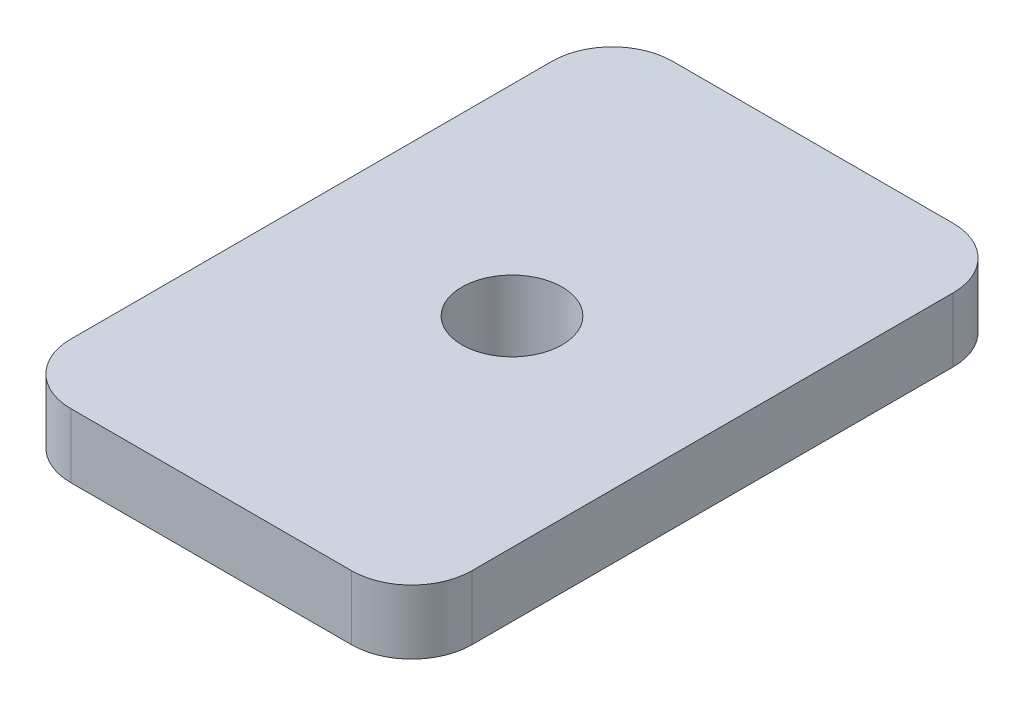
ISO-10303-21;
HEADER;
FILE_DESCRIPTION(('STEP AP214'),'2;1');
FILE_NAME('part.step','',(''),(''),'','','');
FILE_SCHEMA(('AUTOMOTIVE_DESIGN { 1 0 10303 214 1 1 1 1 }'));
ENDSEC;
DATA;
#1=APPLICATION_CONTEXT('core data for automotive mechanical design processes');
#2=APPLICATION_PROTOCOL_DEFINITION('international standard','automotive_design',2000,#1);
#3=PRODUCT_CONTEXT('',#1,'mechanical');
#4=PRODUCT('Part','Part','',(#3));
#5=PRODUCT_RELATED_PRODUCT_CATEGORY('part','',(#4));
#6=PRODUCT_DEFINITION_FORMATION('','',#4);
#7=PRODUCT_DEFINITION_CONTEXT('part definition',#1,'design');
#8=PRODUCT_DEFINITION('design','',#6,#7);
#9=PRODUCT_DEFINITION_SHAPE('','',#8);
#10=(LENGTH_UNIT() NAMED_UNIT(*) SI_UNIT(.MILLI.,.METRE.));
#11=(NAMED_UNIT(*) PLANE_ANGLE_UNIT() SI_UNIT($,.RADIAN.));
#12=(NAMED_UNIT(*) SI_UNIT($,.STERADIAN.) SOLID_ANGLE_UNIT());
#13=UNCERTAINTY_MEASURE_WITH_UNIT(LENGTH_MEASURE(1.E-05),#10,'distance_accuracy_value','');
#14=(GEOMETRIC_REPRESENTATION_CONTEXT(3) GLOBAL_UNCERTAINTY_ASSIGNED_CONTEXT((#13)) GLOBAL_UNIT_ASSIGNED_CONTEXT((#10,
#11,#12)) REPRESENTATION_CONTEXT('',''));
#15=CARTESIAN_POINT('',(0.,0.,0.));
#16=DIRECTION('',(0.,0.,1.));
#17=DIRECTION('',(1.,0.,0.));
#18=AXIS2_PLACEMENT_3D('',#15,#16,#17);
#19=CARTESIAN_POINT('',(0.,1.59999999999999,0.));
#20=DIRECTION('',(1.00000000000001,0.,0.));
#21=DIRECTION('',(0.,0.,-1.));
#22=AXIS2_PLACEMENT_3D('',#19,#20,#21);
#23=PLANE('',#22);
#24=DIRECTION('',(0.,0.,1.));
#25=VECTOR('',#24,1.);
#26=CARTESIAN_POINT('',(0.,1.59999999999999,0.));
#27=LINE('',#26,#25);
#28=CARTESIAN_POINT('',(-5.55111512312578E-13,1.59999999999971,-13.5));
#29=VERTEX_POINT('',#28);
#30=CARTESIAN_POINT('',(0.,1.59999999999999,-1.49999999999995));
#31=VERTEX_POINT('',#30);
#32=EDGE_CURVE('E136',#29,#31,#27,.T.);
#33=ORIENTED_EDGE('',*,*,#32,.F.);
#34=DIRECTION('',(0.,-1.,0.));
#35=VECTOR('',#34,1.);
#36=CARTESIAN_POINT('',(-5.55111512312578E-13,1.59999999999971,-13.5));
#37=LINE('',#36,#35);
#38=CARTESIAN_POINT('',(-5.55111512312578E-13,-2.77555756156289E-13,-13.5));
#39=VERTEX_POINT('',#38);
#40=EDGE_CURVE('E121',#29,#39,#37,.T.);
#41=ORIENTED_EDGE('',*,*,#40,.T.);
#42=DIRECTION('',(0.,0.,1.));
#43=VECTOR('',#42,1.);
#44=CARTESIAN_POINT('',(0.,0.,0.));
#45=LINE('',#44,#43);
#46=CARTESIAN_POINT('',(0.,0.,-1.49999999999995));
#47=VERTEX_POINT('',#46);
#48=EDGE_CURVE('E133',#39,#47,#45,.T.);
#49=ORIENTED_EDGE('',*,*,#48,.T.);
#50=DIRECTION('',(0.,-1.,0.));
#51=VECTOR('',#50,1.);
#52=CARTESIAN_POINT('',(0.,1.59999999999999,-1.49999999999995));
#53=LINE('',#52,#51);
#54=EDGE_CURVE('E138',#47,#31,#53,.F.);
#55=ORIENTED_EDGE('',*,*,#54,.T.);
#56=EDGE_LOOP('',(#33,#41,#49,#55));
#57=FACE_BOUND('',#56,.T.);
#58=ADVANCED_FACE('F49',(#57),#23,.F.);
#59=CARTESIAN_POINT('',(0.,1.59999999999999,0.));
#60=DIRECTION('',(0.,0.,-1.));
#61=DIRECTION('',(-1.00000000000001,0.,0.));
#62=AXIS2_PLACEMENT_3D('',#59,#60,#61);
#63=PLANE('',#62);
#64=DIRECTION('',(1.00000000000001,0.,0.));
#65=VECTOR('',#64,1.);
#66=CARTESIAN_POINT('',(0.,1.59999999999999,0.));
#67=LINE('',#66,#65);
#68=CARTESIAN_POINT('',(1.49999999999995,1.59999999999999,0.));
#69=VERTEX_POINT('',#68);
#70=CARTESIAN_POINT('',(8.49999999999995,1.60000000000055,1.11022302462516E-13));
#71=VERTEX_POINT('',#70);
#72=EDGE_CURVE('E183',#69,#71,#67,.T.);
#73=ORIENTED_EDGE('',*,*,#72,.F.);
#74=DIRECTION('',(0.,-1.,0.));
#75=VECTOR('',#74,1.);
#76=CARTESIAN_POINT('',(1.49999999999995,1.59999999999999,0.));
#77=LINE('',#76,#75);
#78=CARTESIAN_POINT('',(1.49999999999995,0.,0.));
#79=VERTEX_POINT('',#78);
#80=EDGE_CURVE('E53',#69,#79,#77,.T.);
#81=ORIENTED_EDGE('',*,*,#80,.T.);
#82=DIRECTION('',(1.00000000000001,0.,0.));
#83=VECTOR('',#82,1.);
#84=CARTESIAN_POINT('',(0.,0.,0.));
#85=LINE('',#84,#83);
#86=CARTESIAN_POINT('',(8.49999999999995,5.55111512312578E-13,1.11022302462516E-13));
#87=VERTEX_POINT('',#86);
#88=EDGE_CURVE('E143',#79,#87,#85,.T.);
#89=ORIENTED_EDGE('',*,*,#88,.T.);
#90=DIRECTION('',(0.,-1.,0.));
#91=VECTOR('',#90,1.);
#92=CARTESIAN_POINT('',(8.49999999999995,1.60000000000055,1.11022302462516E-13));
#93=LINE('',#92,#91);
#94=EDGE_CURVE('E176',#87,#71,#93,.F.);
#95=ORIENTED_EDGE('',*,*,#94,.T.);
#96=EDGE_LOOP('',(#73,#81,#89,#95));
#97=FACE_BOUND('',#96,.T.);
#98=ADVANCED_FACE('F182',(#97),#63,.F.);
#99=CARTESIAN_POINT('',(10.,1.6000000000011,1.11022302462516E-13));
#100=DIRECTION('',(-1.00000000000001,0.,0.));
#101=DIRECTION('',(0.,0.,1.));
#102=AXIS2_PLACEMENT_3D('',#99,#100,#101);
#103=PLANE('',#102);
#104=DIRECTION('',(0.,0.,-1.));
#105=VECTOR('',#104,1.);
#106=CARTESIAN_POINT('',(10.,1.11022302462516E-12,0.));
#107=LINE('',#106,#105);
#108=CARTESIAN_POINT('',(10.,1.11022302462516E-12,-1.50000000000006));
#109=VERTEX_POINT('',#108);
#110=CARTESIAN_POINT('',(9.99999999999945,8.32667268468867E-13,-13.5000000000001));
#111=VERTEX_POINT('',#110);
#112=EDGE_CURVE('E147',#109,#111,#107,.T.);
#113=ORIENTED_EDGE('',*,*,#112,.T.);
#114=DIRECTION('',(0.,-1.,0.));
#115=VECTOR('',#114,1.);
#116=CARTESIAN_POINT('',(9.99999999999945,1.60000000000082,-13.5));
#117=LINE('',#116,#115);
#118=CARTESIAN_POINT('',(9.99999999999945,1.60000000000082,-13.5));
#119=VERTEX_POINT('',#118);
#120=EDGE_CURVE('E65',#111,#119,#117,.F.);
#121=ORIENTED_EDGE('',*,*,#120,.T.);
#122=DIRECTION('',(0.,0.,-1.));
#123=VECTOR('',#122,1.);
#124=CARTESIAN_POINT('',(10.,1.6000000000011,1.11022302462516E-13));
#125=LINE('',#124,#123);
#126=CARTESIAN_POINT('',(10.,1.6000000000011,-1.49999999999983));
#127=VERTEX_POINT('',#126);
#128=EDGE_CURVE('E190',#127,#119,#125,.T.);
#129=ORIENTED_EDGE('',*,*,#128,.F.);
#130=DIRECTION('',(0.,-1.,0.));
#131=VECTOR('',#130,1.);
#132=CARTESIAN_POINT('',(10.,1.6000000000011,-1.49999999999983));
#133=LINE('',#132,#131);
#134=EDGE_CURVE('E173',#127,#109,#133,.T.);
#135=ORIENTED_EDGE('',*,*,#134,.T.);
#136=EDGE_LOOP('',(#113,#121,#129,#135));
#137=FACE_BOUND('',#136,.T.);
#138=ADVANCED_FACE('F189',(#137),#103,.F.);
#139=CARTESIAN_POINT('',(-5.55111512312578E-13,1.59999999999955,-15.));
#140=DIRECTION('',(0.,0.,1.));
#141=DIRECTION('',(1.00000000000001,0.,0.));
#142=AXIS2_PLACEMENT_3D('',#139,#140,#141);
#143=PLANE('',#142);
#144=DIRECTION('',(-1.00000000000001,0.,0.));
#145=VECTOR('',#144,1.);
#146=CARTESIAN_POINT('',(-5.55111512312578E-13,-4.44089209850063E-13,-15.));
#147=LINE('',#146,#145);
#148=CARTESIAN_POINT('',(8.4999999999994,1.11022302462516E-13,-14.9999999999998));
#149=VERTEX_POINT('',#148);
#150=CARTESIAN_POINT('',(1.49999999999939,-4.44089209850063E-13,-15.));
#151=VERTEX_POINT('',#150);
#152=EDGE_CURVE('E157',#149,#151,#147,.T.);
#153=ORIENTED_EDGE('',*,*,#152,.T.);
#154=DIRECTION('',(0.,-1.,0.));
#155=VECTOR('',#154,1.);
#156=CARTESIAN_POINT('',(1.49999999999939,1.59999999999955,-15.));
#157=LINE('',#156,#155);
#158=CARTESIAN_POINT('',(1.49999999999939,1.59999999999955,-15.));
#159=VERTEX_POINT('',#158);
#160=EDGE_CURVE('E122',#151,#159,#157,.F.);
#161=ORIENTED_EDGE('',*,*,#160,.T.);
#162=DIRECTION('',(-1.00000000000001,0.,0.));
#163=VECTOR('',#162,1.);
#164=CARTESIAN_POINT('',(-5.55111512312578E-13,1.59999999999955,-15.));
#165=LINE('',#164,#163);
#166=CARTESIAN_POINT('',(8.4999999999994,1.6000000000001,-14.9999999999998));
#167=VERTEX_POINT('',#166);
#168=EDGE_CURVE('E153',#167,#159,#165,.T.);
#169=ORIENTED_EDGE('',*,*,#168,.F.);
#170=DIRECTION('',(0.,-1.,0.));
#171=VECTOR('',#170,1.);
#172=CARTESIAN_POINT('',(8.4999999999994,1.6000000000001,-14.9999999999998));
#173=LINE('',#172,#171);
#174=EDGE_CURVE('E127',#167,#149,#173,.T.);
#175=ORIENTED_EDGE('',*,*,#174,.T.);
#176=EDGE_LOOP('',(#153,#161,#169,#175));
#177=FACE_BOUND('',#176,.T.);
#178=ADVANCED_FACE('F206',(#177),#143,.F.);
#179=CARTESIAN_POINT('',(0.,1.59999999999999,0.));
#180=DIRECTION('',(0.,-1.,0.));
#181=DIRECTION('',(0.,0.,-1.));
#182=AXIS2_PLACEMENT_3D('',#179,#180,#181);
#183=PLANE('',#182);
#184=CARTESIAN_POINT('',(4.99999999999901,1.59999999999977,-7.49999999999906));
#185=DIRECTION('',(0.,1.,0.));
#186=DIRECTION('',(0.,0.,1.));
#187=AXIS2_PLACEMENT_3D('',#184,#185,#186);
#188=CIRCLE('',#187,1.24999999999999);
#189=CARTESIAN_POINT('',(4.999999999999,1.59999999999977,-6.24999999999908));
#190=VERTEX_POINT('',#189);
#191=EDGE_CURVE('E198',#190,#190,#188,.T.);
#192=ORIENTED_EDGE('',*,*,#191,.F.);
#193=EDGE_LOOP('',(#192));
#194=FACE_BOUND('',#193,.T.);
#195=ORIENTED_EDGE('',*,*,#168,.T.);
#196=CARTESIAN_POINT('',(1.49999999999939,1.59999999999971,-13.5));
#197=DIRECTION('',(0.,-1.,0.));
#198=DIRECTION('',(0.,0.,-1.));
#199=AXIS2_PLACEMENT_3D('',#196,#197,#198);
#200=CIRCLE('',#199,1.5);
#201=EDGE_CURVE('E171',#159,#29,#200,.F.);
#202=ORIENTED_EDGE('',*,*,#201,.T.);
#203=ORIENTED_EDGE('',*,*,#32,.T.);
#204=CARTESIAN_POINT('',(1.49999999999995,1.59999999999999,-1.50000000000006));
#205=DIRECTION('',(0.,-1.,0.));
#206=DIRECTION('',(0.,0.,-1.));
#207=AXIS2_PLACEMENT_3D('',#204,#205,#206);
#208=CIRCLE('',#207,1.5);
#209=EDGE_CURVE('E167',#31,#69,#208,.F.);
#210=ORIENTED_EDGE('',*,*,#209,.T.);
#211=ORIENTED_EDGE('',*,*,#72,.T.);
#212=CARTESIAN_POINT('',(8.49999999999995,1.60000000000055,-1.49999999999995));
#213=DIRECTION('',(0.,-1.,0.));
#214=DIRECTION('',(0.,0.,-1.));
#215=AXIS2_PLACEMENT_3D('',#212,#213,#214);
#216=CIRCLE('',#215,1.5);
#217=EDGE_CURVE('E72',#71,#127,#216,.F.);
#218=ORIENTED_EDGE('',*,*,#217,.T.);
#219=ORIENTED_EDGE('',*,*,#128,.T.);
#220=CARTESIAN_POINT('',(8.4999999999994,1.60000000000027,-13.4999999999997));
#221=DIRECTION('',(0.,-1.,0.));
#222=DIRECTION('',(0.,0.,-1.));
#223=AXIS2_PLACEMENT_3D('',#220,#221,#222);
#224=CIRCLE('',#223,1.5);
#225=EDGE_CURVE('E169',#119,#167,#224,.F.);
#226=ORIENTED_EDGE('',*,*,#225,.T.);
#227=EDGE_LOOP('',(#195,#202,#203,#210,#211,#218,#219,#226));
#228=FACE_BOUND('',#227,.T.);
#229=ADVANCED_FACE('F204',(#194,#228),#183,.F.);
#230=CARTESIAN_POINT('',(0.,0.,0.));
#231=DIRECTION('',(0.,-1.,0.));
#232=DIRECTION('',(0.,0.,-1.));
#233=AXIS2_PLACEMENT_3D('',#230,#231,#232);
#234=PLANE('',#233);
#235=CARTESIAN_POINT('',(4.99999999999901,-2.22044604925031E-13,-7.49999999999917));
#236=DIRECTION('',(0.,-1.,0.));
#237=DIRECTION('',(0.,0.,-1.));
#238=AXIS2_PLACEMENT_3D('',#235,#236,#237);
#239=CIRCLE('',#238,3.45);
#240=CARTESIAN_POINT('',(4.99999999999902,-2.2265577185751E-13,-10.9499999999992));
#241=VERTEX_POINT('',#240);
#242=EDGE_CURVE('E11',#241,#241,#239,.T.);
#243=ORIENTED_EDGE('',*,*,#242,.F.);
#244=EDGE_LOOP('',(#243));
#245=FACE_BOUND('',#244,.T.);
#246=ORIENTED_EDGE('',*,*,#48,.F.);
#247=CARTESIAN_POINT('',(1.49999999999939,-2.77555756156289E-13,-13.5));
#248=DIRECTION('',(0.,-1.,0.));
#249=DIRECTION('',(0.,0.,-1.));
#250=AXIS2_PLACEMENT_3D('',#247,#248,#249);
#251=CIRCLE('',#250,1.5);
#252=EDGE_CURVE('E117',#39,#151,#251,.T.);
#253=ORIENTED_EDGE('',*,*,#252,.T.);
#254=ORIENTED_EDGE('',*,*,#152,.F.);
#255=CARTESIAN_POINT('',(8.4999999999994,2.77555756156289E-13,-13.5));
#256=DIRECTION('',(0.,-1.,0.));
#257=DIRECTION('',(0.,0.,-1.));
#258=AXIS2_PLACEMENT_3D('',#255,#256,#257);
#259=CIRCLE('',#258,1.5);
#260=EDGE_CURVE('E128',#149,#111,#259,.T.);
#261=ORIENTED_EDGE('',*,*,#260,.T.);
#262=ORIENTED_EDGE('',*,*,#112,.F.);
#263=CARTESIAN_POINT('',(8.49999999999995,5.55111512312578E-13,-1.49999999999995));
#264=DIRECTION('',(0.,-1.,0.));
#265=DIRECTION('',(0.,0.,-1.));
#266=AXIS2_PLACEMENT_3D('',#263,#264,#265);
#267=CIRCLE('',#266,1.5);
#268=EDGE_CURVE('E137',#109,#87,#267,.T.);
#269=ORIENTED_EDGE('',*,*,#268,.T.);
#270=ORIENTED_EDGE('',*,*,#88,.F.);
#271=CARTESIAN_POINT('',(1.49999999999995,0.,-1.50000000000006));
#272=DIRECTION('',(0.,-1.,0.));
#273=DIRECTION('',(0.,0.,-1.));
#274=AXIS2_PLACEMENT_3D('',#271,#272,#273);
#275=CIRCLE('',#274,1.5);
#276=EDGE_CURVE('E142',#79,#47,#275,.T.);
#277=ORIENTED_EDGE('',*,*,#276,.T.);
#278=EDGE_LOOP('',(#246,#253,#254,#261,#262,#269,#270,#277));
#279=FACE_BOUND('',#278,.T.);
#280=ADVANCED_FACE('F140',(#245,#279),#234,.T.);
#281=CARTESIAN_POINT('',(1.49999999999939,1.59999999999971,-13.5));
#282=DIRECTION('',(0.,-1.,0.));
#283=DIRECTION('',(0.,0.,-1.));
#284=AXIS2_PLACEMENT_3D('',#281,#282,#283);
#285=CYLINDRICAL_SURFACE('',#284,1.5);
#286=ORIENTED_EDGE('',*,*,#201,.F.);
#287=ORIENTED_EDGE('',*,*,#160,.F.);
#288=ORIENTED_EDGE('',*,*,#252,.F.);
#289=ORIENTED_EDGE('',*,*,#40,.F.);
#290=EDGE_LOOP('',(#286,#287,#288,#289));
#291=FACE_BOUND('',#290,.T.);
#292=ADVANCED_FACE('F120',(#291),#285,.T.);
#293=CARTESIAN_POINT('',(8.4999999999994,1.60000000000027,-13.4999999999997));
#294=DIRECTION('',(0.,-1.,0.));
#295=DIRECTION('',(0.,0.,-1.));
#296=AXIS2_PLACEMENT_3D('',#293,#294,#295);
#297=CYLINDRICAL_SURFACE('',#296,1.5);
#298=ORIENTED_EDGE('',*,*,#225,.F.);
#299=ORIENTED_EDGE('',*,*,#120,.F.);
#300=ORIENTED_EDGE('',*,*,#260,.F.);
#301=ORIENTED_EDGE('',*,*,#174,.F.);
#302=EDGE_LOOP('',(#298,#299,#300,#301));
#303=FACE_BOUND('',#302,.T.);
#304=ADVANCED_FACE('F212',(#303),#297,.T.);
#305=CARTESIAN_POINT('',(1.49999999999995,1.59999999999999,-1.50000000000006));
#306=DIRECTION('',(0.,-1.,0.));
#307=DIRECTION('',(0.,0.,-1.));
#308=AXIS2_PLACEMENT_3D('',#305,#306,#307);
#309=CYLINDRICAL_SURFACE('',#308,1.5);
#310=ORIENTED_EDGE('',*,*,#209,.F.);
#311=ORIENTED_EDGE('',*,*,#54,.F.);
#312=ORIENTED_EDGE('',*,*,#276,.F.);
#313=ORIENTED_EDGE('',*,*,#80,.F.);
#314=EDGE_LOOP('',(#310,#311,#312,#313));
#315=FACE_BOUND('',#314,.T.);
#316=ADVANCED_FACE('F214',(#315),#309,.T.);
#317=CARTESIAN_POINT('',(8.49999999999995,1.60000000000055,-1.49999999999995));
#318=DIRECTION('',(0.,-1.,0.));
#319=DIRECTION('',(0.,0.,-1.));
#320=AXIS2_PLACEMENT_3D('',#317,#318,#319);
#321=CYLINDRICAL_SURFACE('',#320,1.5);
#322=ORIENTED_EDGE('',*,*,#217,.F.);
#323=ORIENTED_EDGE('',*,*,#94,.F.);
#324=ORIENTED_EDGE('',*,*,#268,.F.);
#325=ORIENTED_EDGE('',*,*,#134,.F.);
#326=EDGE_LOOP('',(#322,#323,#324,#325));
#327=FACE_BOUND('',#326,.T.);
#328=ADVANCED_FACE('F51',(#327),#321,.T.);
#329=CARTESIAN_POINT('',(4.99999999999901,-1.40000000000023,-7.49999999999856));
#330=DIRECTION('',(0.,1.,0.));
#331=DIRECTION('',(0.,0.,1.));
#332=AXIS2_PLACEMENT_3D('',#329,#330,#331);
#333=CYLINDRICAL_SURFACE('',#332,3.45);
#334=CARTESIAN_POINT('',(4.99999999999901,-1.40000000000023,-7.49999999999856));
#335=DIRECTION('',(0.,-1.,0.));
#336=DIRECTION('',(0.,0.,-1.));
#337=AXIS2_PLACEMENT_3D('',#334,#335,#336);
#338=CIRCLE('',#337,3.45);
#339=CARTESIAN_POINT('',(4.99999999999902,-1.40000000000024,-10.9499999999986));
#340=VERTEX_POINT('',#339);
#341=EDGE_CURVE('E144',#340,#340,#338,.T.);
#342=ORIENTED_EDGE('',*,*,#341,.F.);
#343=EDGE_LOOP('',(#342));
#344=FACE_BOUND('',#343,.T.);
#345=ORIENTED_EDGE('',*,*,#242,.T.);
#346=EDGE_LOOP('',(#345));
#347=FACE_BOUND('',#346,.T.);
#348=ADVANCED_FACE('F235',(#344,#347),#333,.T.);
#349=CARTESIAN_POINT('',(4.99999999999901,-1.40000000000023,-7.49999999999856));
#350=DIRECTION('',(0.,-1.,0.));
#351=DIRECTION('',(0.,0.,-1.));
#352=AXIS2_PLACEMENT_3D('',#349,#350,#351);
#353=PLANE('',#352);
#354=CARTESIAN_POINT('',(4.99999999999901,-1.40000000000023,-7.49999999999856));
#355=DIRECTION('',(0.,1.,0.));
#356=DIRECTION('',(0.,0.,1.));
#357=AXIS2_PLACEMENT_3D('',#354,#355,#356);
#358=CIRCLE('',#357,1.25);
#359=CARTESIAN_POINT('',(4.999999999999,-1.40000000000023,-6.24999999999856));
#360=VERTEX_POINT('',#359);
#361=EDGE_CURVE('E150',#360,#360,#358,.T.);
#362=ORIENTED_EDGE('',*,*,#361,.T.);
#363=EDGE_LOOP('',(#362));
#364=FACE_BOUND('',#363,.T.);
#365=ORIENTED_EDGE('',*,*,#341,.T.);
#366=EDGE_LOOP('',(#365));
#367=FACE_BOUND('',#366,.T.);
#368=ADVANCED_FACE('F238',(#364,#367),#353,.T.);
#369=CARTESIAN_POINT('',(4.99999999999901,1.59999999999977,-7.49999999999906));
#370=DIRECTION('',(0.,1.,0.));
#371=DIRECTION('',(0.,0.,1.));
#372=AXIS2_PLACEMENT_3D('',#369,#370,#371);
#373=CYLINDRICAL_SURFACE('',#372,1.24999999999999);
#374=ORIENTED_EDGE('',*,*,#361,.F.);
#375=EDGE_LOOP('',(#374));
#376=FACE_BOUND('',#375,.T.);
#377=ORIENTED_EDGE('',*,*,#191,.T.);
#378=EDGE_LOOP('',(#377));
#379=FACE_BOUND('',#378,.T.);
#380=ADVANCED_FACE('F202',(#376,#379),#373,.F.);
#381=CLOSED_SHELL('',(#58,#98,#138,#178,#229,#280,#292,#304,#316,#328,#348,#368,#380));
#382=MANIFOLD_SOLID_BREP('B2',#381);
#383=ADVANCED_BREP_SHAPE_REPRESENTATION('',(#18,#382),#14);
#384=SHAPE_DEFINITION_REPRESENTATION(#9,#383);
ENDSEC;
END-ISO-10303-21;
